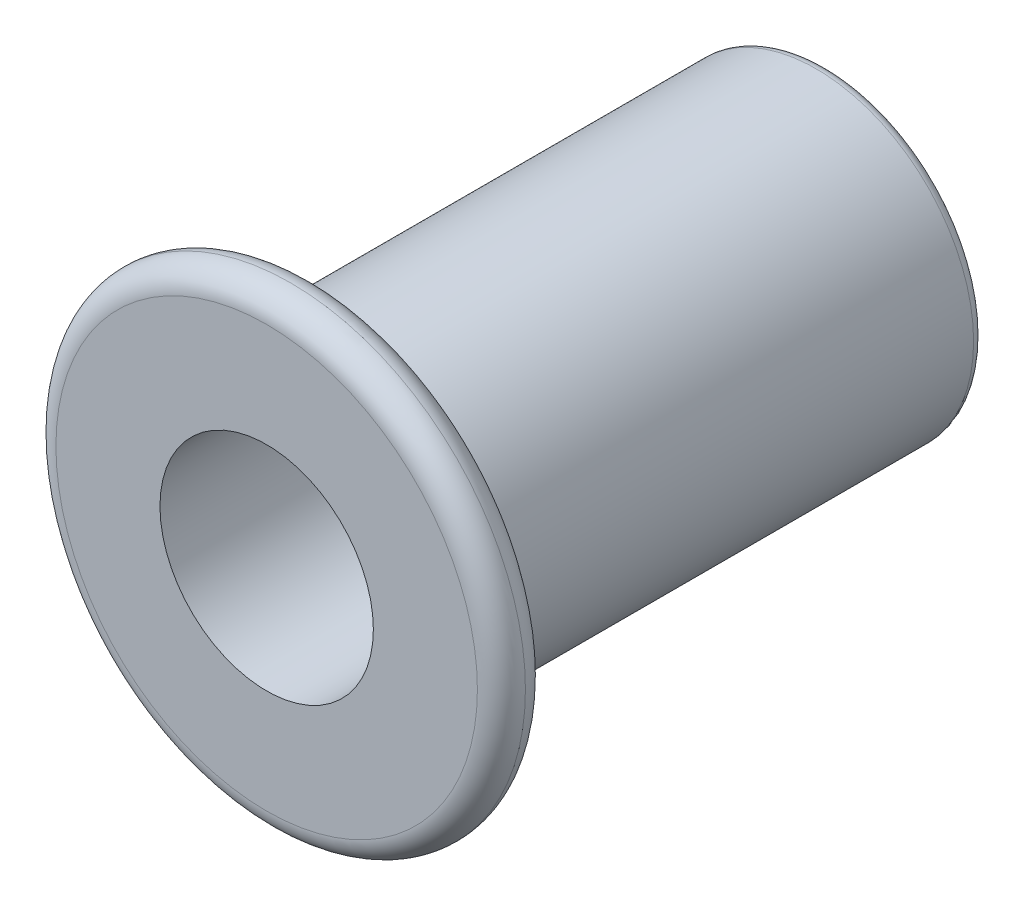
ISO-10303-21;
HEADER;
FILE_DESCRIPTION(('STEP AP214'),'2;1');
FILE_NAME('part.step','',(''),(''),'','','');
FILE_SCHEMA(('AUTOMOTIVE_DESIGN { 1 0 10303 214 1 1 1 1 }'));
ENDSEC;
DATA;
#1=APPLICATION_CONTEXT('core data for automotive mechanical design processes');
#2=APPLICATION_PROTOCOL_DEFINITION('international standard','automotive_design',2000,#1);
#3=PRODUCT_CONTEXT('',#1,'mechanical');
#4=PRODUCT('Part','Part','',(#3));
#5=PRODUCT_RELATED_PRODUCT_CATEGORY('part','',(#4));
#6=PRODUCT_DEFINITION_FORMATION('','',#4);
#7=PRODUCT_DEFINITION_CONTEXT('part definition',#1,'design');
#8=PRODUCT_DEFINITION('design','',#6,#7);
#9=PRODUCT_DEFINITION_SHAPE('','',#8);
#10=(LENGTH_UNIT() NAMED_UNIT(*) SI_UNIT(.MILLI.,.METRE.));
#11=(NAMED_UNIT(*) PLANE_ANGLE_UNIT() SI_UNIT($,.RADIAN.));
#12=(NAMED_UNIT(*) SI_UNIT($,.STERADIAN.) SOLID_ANGLE_UNIT());
#13=UNCERTAINTY_MEASURE_WITH_UNIT(LENGTH_MEASURE(1.E-05),#10,'distance_accuracy_value','');
#14=(GEOMETRIC_REPRESENTATION_CONTEXT(3) GLOBAL_UNCERTAINTY_ASSIGNED_CONTEXT((#13)) GLOBAL_UNIT_ASSIGNED_CONTEXT((#10,
#11,#12)) REPRESENTATION_CONTEXT('',''));
#15=CARTESIAN_POINT('',(0.,0.,0.));
#16=DIRECTION('',(0.,0.,1.));
#17=DIRECTION('',(1.,0.,0.));
#18=AXIS2_PLACEMENT_3D('',#15,#16,#17);
#19=CARTESIAN_POINT('',(0.,0.,-9.6));
#20=DIRECTION('',(0.,0.,1.));
#21=DIRECTION('',(1.,0.,0.));
#22=AXIS2_PLACEMENT_3D('',#19,#20,#21);
#23=CYLINDRICAL_SURFACE('',#22,2.95);
#24=CARTESIAN_POINT('',(0.,0.,-9.4));
#25=DIRECTION('',(0.,0.,1.));
#26=DIRECTION('',(1.,0.,0.));
#27=AXIS2_PLACEMENT_3D('',#24,#25,#26);
#28=CIRCLE('',#27,2.95);
#29=CARTESIAN_POINT('',(2.95,0.,-9.4));
#30=VERTEX_POINT('',#29);
#31=EDGE_CURVE('E10',#30,#30,#28,.T.);
#32=ORIENTED_EDGE('',*,*,#31,.T.);
#33=EDGE_LOOP('',(#32));
#34=FACE_BOUND('',#33,.T.);
#35=CARTESIAN_POINT('',(0.,0.,0.));
#36=DIRECTION('',(0.,0.,1.));
#37=DIRECTION('',(1.,0.,0.));
#38=AXIS2_PLACEMENT_3D('',#35,#36,#37);
#39=CIRCLE('',#38,2.95);
#40=CARTESIAN_POINT('',(2.95,0.,0.));
#41=VERTEX_POINT('',#40);
#42=EDGE_CURVE('E62',#41,#41,#39,.T.);
#43=ORIENTED_EDGE('',*,*,#42,.F.);
#44=EDGE_LOOP('',(#43));
#45=FACE_BOUND('',#44,.T.);
#46=ADVANCED_FACE('F32',(#34,#45),#23,.T.);
#47=CARTESIAN_POINT('',(0.,0.,-9.6));
#48=DIRECTION('',(0.,0.,1.));
#49=DIRECTION('',(1.,0.,0.));
#50=AXIS2_PLACEMENT_3D('',#47,#48,#49);
#51=PLANE('',#50);
#52=CARTESIAN_POINT('',(0.,0.,-9.6));
#53=DIRECTION('',(0.,0.,1.));
#54=DIRECTION('',(1.,0.,0.));
#55=AXIS2_PLACEMENT_3D('',#52,#53,#54);
#56=CIRCLE('',#55,2.2);
#57=CARTESIAN_POINT('',(2.2,0.,-9.6));
#58=VERTEX_POINT('',#57);
#59=EDGE_CURVE('E43',#58,#58,#56,.T.);
#60=ORIENTED_EDGE('',*,*,#59,.T.);
#61=EDGE_LOOP('',(#60));
#62=FACE_BOUND('',#61,.T.);
#63=CARTESIAN_POINT('',(0.,0.,-9.6));
#64=DIRECTION('',(0.,0.,1.));
#65=DIRECTION('',(1.,0.,0.));
#66=AXIS2_PLACEMENT_3D('',#63,#64,#65);
#67=CIRCLE('',#66,2.75);
#68=CARTESIAN_POINT('',(2.75,0.,-9.6));
#69=VERTEX_POINT('',#68);
#70=EDGE_CURVE('E47',#69,#69,#67,.F.);
#71=ORIENTED_EDGE('',*,*,#70,.T.);
#72=EDGE_LOOP('',(#71));
#73=FACE_BOUND('',#72,.T.);
#74=ADVANCED_FACE('F82',(#62,#73),#51,.F.);
#75=CARTESIAN_POINT('',(0.,0.,-9.6));
#76=DIRECTION('',(0.,0.,1.));
#77=DIRECTION('',(1.,0.,0.));
#78=AXIS2_PLACEMENT_3D('',#75,#76,#77);
#79=CYLINDRICAL_SURFACE('',#78,2.);
#80=CARTESIAN_POINT('',(0.,0.,-9.4));
#81=DIRECTION('',(0.,0.,1.));
#82=DIRECTION('',(1.,0.,0.));
#83=AXIS2_PLACEMENT_3D('',#80,#81,#82);
#84=CIRCLE('',#83,2.);
#85=CARTESIAN_POINT('',(2.,0.,-9.4));
#86=VERTEX_POINT('',#85);
#87=EDGE_CURVE('E39',#86,#86,#84,.F.);
#88=ORIENTED_EDGE('',*,*,#87,.T.);
#89=EDGE_LOOP('',(#88));
#90=FACE_BOUND('',#89,.T.);
#91=CARTESIAN_POINT('',(0.,0.,0.9));
#92=DIRECTION('',(0.,0.,1.));
#93=DIRECTION('',(1.,0.,0.));
#94=AXIS2_PLACEMENT_3D('',#91,#92,#93);
#95=CIRCLE('',#94,2.);
#96=CARTESIAN_POINT('',(2.,0.,0.9));
#97=VERTEX_POINT('',#96);
#98=EDGE_CURVE('E56',#97,#97,#95,.T.);
#99=ORIENTED_EDGE('',*,*,#98,.T.);
#100=EDGE_LOOP('',(#99));
#101=FACE_BOUND('',#100,.T.);
#102=ADVANCED_FACE('F68',(#90,#101),#79,.F.);
#103=CARTESIAN_POINT('',(0.,0.,0.9));
#104=DIRECTION('',(0.,0.,1.));
#105=DIRECTION('',(1.,0.,0.));
#106=AXIS2_PLACEMENT_3D('',#103,#104,#105);
#107=PLANE('',#106);
#108=CARTESIAN_POINT('',(0.,0.,0.9));
#109=DIRECTION('',(0.,0.,1.));
#110=DIRECTION('',(1.,0.,0.));
#111=AXIS2_PLACEMENT_3D('',#108,#109,#110);
#112=CIRCLE('',#111,3.95);
#113=CARTESIAN_POINT('',(3.95,0.,0.9));
#114=VERTEX_POINT('',#113);
#115=EDGE_CURVE('E52',#114,#114,#112,.T.);
#116=ORIENTED_EDGE('',*,*,#115,.T.);
#117=EDGE_LOOP('',(#116));
#118=FACE_BOUND('',#117,.T.);
#119=ORIENTED_EDGE('',*,*,#98,.F.);
#120=EDGE_LOOP('',(#119));
#121=FACE_BOUND('',#120,.T.);
#122=ADVANCED_FACE('F70',(#118,#121),#107,.T.);
#123=CARTESIAN_POINT('',(0.,0.,0.));
#124=DIRECTION('',(0.,0.,1.));
#125=DIRECTION('',(1.,0.,0.));
#126=AXIS2_PLACEMENT_3D('',#123,#124,#125);
#127=PLANE('',#126);
#128=CARTESIAN_POINT('',(0.,0.,0.));
#129=DIRECTION('',(0.,0.,1.));
#130=DIRECTION('',(1.,0.,0.));
#131=AXIS2_PLACEMENT_3D('',#128,#129,#130);
#132=CIRCLE('',#131,3.95);
#133=CARTESIAN_POINT('',(3.95,0.,0.));
#134=VERTEX_POINT('',#133);
#135=EDGE_CURVE('E59',#134,#134,#132,.F.);
#136=ORIENTED_EDGE('',*,*,#135,.T.);
#137=EDGE_LOOP('',(#136));
#138=FACE_BOUND('',#137,.T.);
#139=ORIENTED_EDGE('',*,*,#42,.T.);
#140=EDGE_LOOP('',(#139));
#141=FACE_BOUND('',#140,.T.);
#142=ADVANCED_FACE('F72',(#138,#141),#127,.F.);
#143=CARTESIAN_POINT('',(0.,0.,0.45));
#144=DIRECTION('',(0.,0.,1.));
#145=DIRECTION('',(1.,0.,0.));
#146=AXIS2_PLACEMENT_3D('',#143,#144,#145);
#147=TOROIDAL_SURFACE('',#146,3.95,0.45);
#148=ORIENTED_EDGE('',*,*,#115,.F.);
#149=EDGE_LOOP('',(#148));
#150=FACE_BOUND('',#149,.T.);
#151=CARTESIAN_POINT('',(0.,0.,0.45));
#152=DIRECTION('',(0.,0.,1.));
#153=DIRECTION('',(1.,0.,0.));
#154=AXIS2_PLACEMENT_3D('',#151,#152,#153);
#155=CIRCLE('',#154,4.4);
#156=CARTESIAN_POINT('',(4.4,0.,0.45));
#157=VERTEX_POINT('',#156);
#158=EDGE_CURVE('E53',#157,#157,#155,.F.);
#159=ORIENTED_EDGE('',*,*,#158,.F.);
#160=EDGE_LOOP('',(#159));
#161=FACE_BOUND('',#160,.T.);
#162=ADVANCED_FACE('F79',(#150,#161),#147,.T.);
#163=CARTESIAN_POINT('',(0.,0.,0.45));
#164=DIRECTION('',(0.,0.,1.));
#165=DIRECTION('',(1.,0.,0.));
#166=AXIS2_PLACEMENT_3D('',#163,#164,#165);
#167=TOROIDAL_SURFACE('',#166,3.95,0.45);
#168=ORIENTED_EDGE('',*,*,#135,.F.);
#169=EDGE_LOOP('',(#168));
#170=FACE_BOUND('',#169,.T.);
#171=ORIENTED_EDGE('',*,*,#158,.T.);
#172=EDGE_LOOP('',(#171));
#173=FACE_BOUND('',#172,.T.);
#174=ADVANCED_FACE('F93',(#170,#173),#167,.T.);
#175=CARTESIAN_POINT('',(0.,0.,-9.4));
#176=DIRECTION('',(0.,0.,1.));
#177=DIRECTION('',(1.,0.,0.));
#178=AXIS2_PLACEMENT_3D('',#175,#176,#177);
#179=TOROIDAL_SURFACE('',#178,2.2,0.2);
#180=ORIENTED_EDGE('',*,*,#87,.F.);
#181=EDGE_LOOP('',(#180));
#182=FACE_BOUND('',#181,.T.);
#183=ORIENTED_EDGE('',*,*,#59,.F.);
#184=EDGE_LOOP('',(#183));
#185=FACE_BOUND('',#184,.T.);
#186=ADVANCED_FACE('F96',(#182,#185),#179,.T.);
#187=CARTESIAN_POINT('',(0.,0.,-9.4));
#188=DIRECTION('',(0.,0.,1.));
#189=DIRECTION('',(1.,0.,0.));
#190=AXIS2_PLACEMENT_3D('',#187,#188,#189);
#191=TOROIDAL_SURFACE('',#190,2.75,0.2);
#192=ORIENTED_EDGE('',*,*,#70,.F.);
#193=EDGE_LOOP('',(#192));
#194=FACE_BOUND('',#193,.T.);
#195=ORIENTED_EDGE('',*,*,#31,.F.);
#196=EDGE_LOOP('',(#195));
#197=FACE_BOUND('',#196,.T.);
#198=ADVANCED_FACE('F34',(#194,#197),#191,.T.);
#199=CLOSED_SHELL('',(#46,#74,#102,#122,#142,#162,#174,#186,#198));
#200=MANIFOLD_SOLID_BREP('B2',#199);
#201=ADVANCED_BREP_SHAPE_REPRESENTATION('',(#18,#200),#14);
#202=SHAPE_DEFINITION_REPRESENTATION(#9,#201);
ENDSEC;
END-ISO-10303-21;
